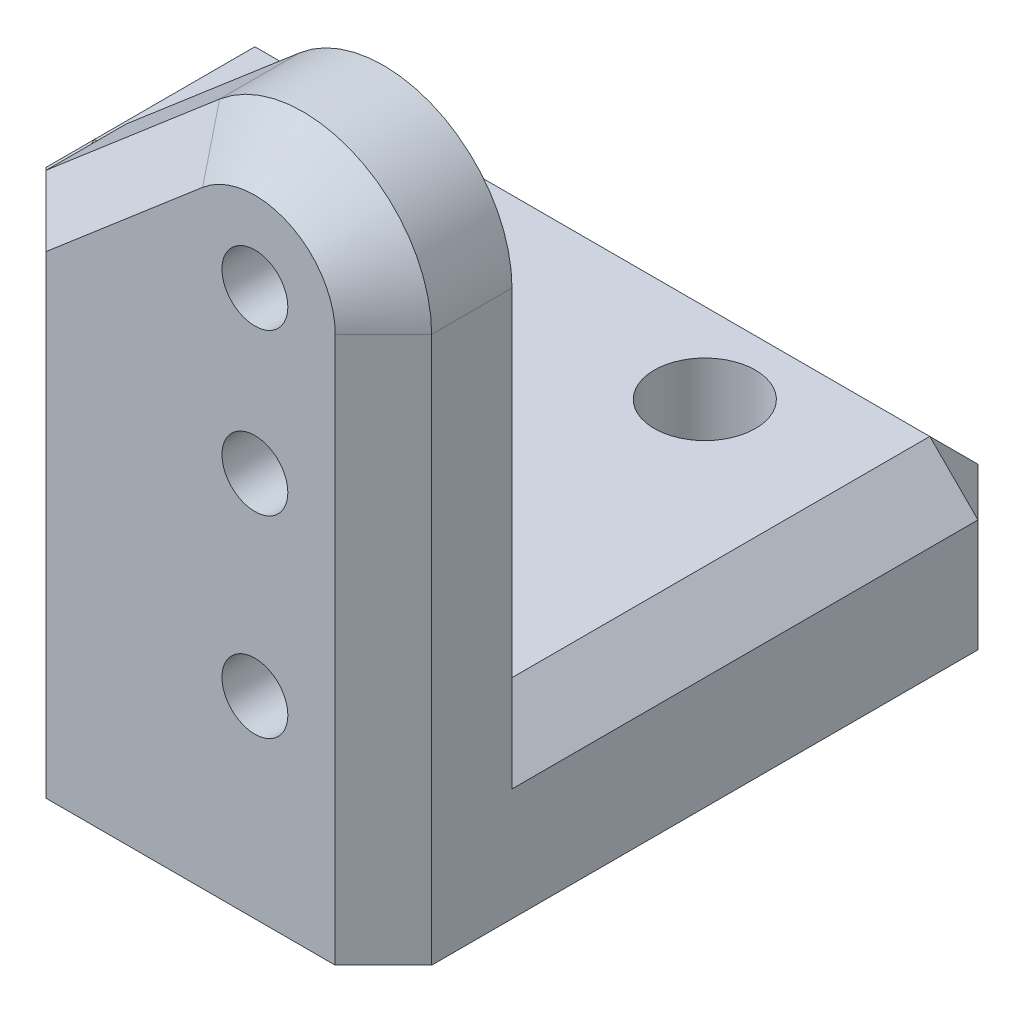
ISO-10303-21;
HEADER;
FILE_DESCRIPTION(('STEP AP214'),'2;1');
FILE_NAME('part.step','',(''),(''),'','','');
FILE_SCHEMA(('AUTOMOTIVE_DESIGN { 1 0 10303 214 1 1 1 1 }'));
ENDSEC;
DATA;
#1=APPLICATION_CONTEXT('core data for automotive mechanical design processes');
#2=APPLICATION_PROTOCOL_DEFINITION('international standard','automotive_design',2000,#1);
#3=PRODUCT_CONTEXT('',#1,'mechanical');
#4=PRODUCT('Part','Part','',(#3));
#5=PRODUCT_RELATED_PRODUCT_CATEGORY('part','',(#4));
#6=PRODUCT_DEFINITION_FORMATION('','',#4);
#7=PRODUCT_DEFINITION_CONTEXT('part definition',#1,'design');
#8=PRODUCT_DEFINITION('design','',#6,#7);
#9=PRODUCT_DEFINITION_SHAPE('','',#8);
#10=(LENGTH_UNIT() NAMED_UNIT(*) SI_UNIT(.MILLI.,.METRE.));
#11=(NAMED_UNIT(*) PLANE_ANGLE_UNIT() SI_UNIT($,.RADIAN.));
#12=(NAMED_UNIT(*) SI_UNIT($,.STERADIAN.) SOLID_ANGLE_UNIT());
#13=UNCERTAINTY_MEASURE_WITH_UNIT(LENGTH_MEASURE(1.E-05),#10,'distance_accuracy_value','');
#14=(GEOMETRIC_REPRESENTATION_CONTEXT(3) GLOBAL_UNCERTAINTY_ASSIGNED_CONTEXT((#13)) GLOBAL_UNIT_ASSIGNED_CONTEXT((#10,
#11,#12)) REPRESENTATION_CONTEXT('',''));
#15=CARTESIAN_POINT('',(0.,0.,0.));
#16=DIRECTION('',(0.,0.,1.));
#17=DIRECTION('',(1.,0.,0.));
#18=AXIS2_PLACEMENT_3D('',#15,#16,#17);
#19=CARTESIAN_POINT('',(12.,17.,20.));
#20=DIRECTION('',(0.,0.,-1.));
#21=DIRECTION('',(-1.,0.,0.));
#22=AXIS2_PLACEMENT_3D('',#19,#20,#21);
#23=PLANE('',#22);
#24=CARTESIAN_POINT('',(12.,6.,20.));
#25=DIRECTION('',(0.,0.,1.));
#26=DIRECTION('',(1.,0.,0.));
#27=AXIS2_PLACEMENT_3D('',#24,#25,#26);
#28=CIRCLE('',#27,1.025);
#29=CARTESIAN_POINT('',(13.025,6.,20.));
#30=VERTEX_POINT('',#29);
#31=EDGE_CURVE('E192',#30,#30,#28,.T.);
#32=ORIENTED_EDGE('',*,*,#31,.F.);
#33=EDGE_LOOP('',(#32));
#34=FACE_BOUND('',#33,.T.);
#35=CARTESIAN_POINT('',(12.,17.,20.));
#36=DIRECTION('',(0.,0.,1.));
#37=DIRECTION('',(1.,0.,0.));
#38=AXIS2_PLACEMENT_3D('',#35,#36,#37);
#39=CIRCLE('',#38,1.025);
#40=CARTESIAN_POINT('',(13.025,17.,20.));
#41=VERTEX_POINT('',#40);
#42=EDGE_CURVE('E357',#41,#41,#39,.T.);
#43=ORIENTED_EDGE('',*,*,#42,.F.);
#44=EDGE_LOOP('',(#43));
#45=FACE_BOUND('',#44,.T.);
#46=DIRECTION('',(1.,0.,0.));
#47=VECTOR('',#46,1.);
#48=CARTESIAN_POINT('',(16.,0.,20.));
#49=LINE('',#48,#47);
#50=CARTESIAN_POINT('',(5.50000000000001,0.,20.));
#51=VERTEX_POINT('',#50);
#52=CARTESIAN_POINT('',(14.5,0.,20.));
#53=VERTEX_POINT('',#52);
#54=EDGE_CURVE('E216',#51,#53,#49,.T.);
#55=ORIENTED_EDGE('',*,*,#54,.T.);
#56=DIRECTION('',(0.,1.,0.));
#57=VECTOR('',#56,1.);
#58=CARTESIAN_POINT('',(14.5,17.,20.));
#59=LINE('',#58,#57);
#60=CARTESIAN_POINT('',(14.5,17.,20.));
#61=VERTEX_POINT('',#60);
#62=EDGE_CURVE('E234',#53,#61,#59,.T.);
#63=ORIENTED_EDGE('',*,*,#62,.T.);
#64=CARTESIAN_POINT('',(12.,17.,20.));
#65=DIRECTION('',(0.,0.,-1.));
#66=DIRECTION('',(-1.,0.,0.));
#67=AXIS2_PLACEMENT_3D('',#64,#65,#66);
#68=CIRCLE('',#67,2.49999999999999);
#69=CARTESIAN_POINT('',(10.37505052686,18.899878735536,20.));
#70=VERTEX_POINT('',#69);
#71=EDGE_CURVE('E232',#61,#70,#68,.F.);
#72=ORIENTED_EDGE('',*,*,#71,.T.);
#73=DIRECTION('',(-0.759951494214413,-0.649979789256005,0.));
#74=VECTOR('',#73,1.);
#75=CARTESIAN_POINT('',(10.37505052686,18.899878735536,20.));
#76=LINE('',#75,#74);
#77=CARTESIAN_POINT('',(5.50000000000001,14.7302911524017,20.));
#78=VERTEX_POINT('',#77);
#79=EDGE_CURVE('E230',#70,#78,#76,.T.);
#80=ORIENTED_EDGE('',*,*,#79,.T.);
#81=DIRECTION('',(0.,-1.,0.));
#82=VECTOR('',#81,1.);
#83=CARTESIAN_POINT('',(5.50000000000001,17.,20.));
#84=LINE('',#83,#82);
#85=EDGE_CURVE('E228',#78,#51,#84,.T.);
#86=ORIENTED_EDGE('',*,*,#85,.T.);
#87=EDGE_LOOP('',(#55,#63,#72,#80,#86));
#88=FACE_BOUND('',#87,.T.);
#89=CARTESIAN_POINT('',(12.,12.,20.));
#90=DIRECTION('',(0.,0.,1.));
#91=DIRECTION('',(1.,0.,0.));
#92=AXIS2_PLACEMENT_3D('',#89,#90,#91);
#93=CIRCLE('',#92,1.025);
#94=CARTESIAN_POINT('',(13.025,12.,20.));
#95=VERTEX_POINT('',#94);
#96=EDGE_CURVE('E191',#95,#95,#93,.T.);
#97=ORIENTED_EDGE('',*,*,#96,.F.);
#98=EDGE_LOOP('',(#97));
#99=FACE_BOUND('',#98,.T.);
#100=ADVANCED_FACE('F43',(#34,#45,#88,#99),#23,.F.);
#101=CARTESIAN_POINT('',(-4.,5.,0.));
#102=DIRECTION('',(0.,-1.,0.));
#103=DIRECTION('',(0.,0.,-1.));
#104=AXIS2_PLACEMENT_3D('',#101,#102,#103);
#105=PLANE('',#104);
#106=CARTESIAN_POINT('',(-2.,5.,4.00000000000001));
#107=DIRECTION('',(0.,-1.,0.));
#108=DIRECTION('',(0.,0.,-1.));
#109=AXIS2_PLACEMENT_3D('',#106,#107,#108);
#110=CIRCLE('',#109,1.575);
#111=CARTESIAN_POINT('',(-2.,5.,2.42500000000001));
#112=VERTEX_POINT('',#111);
#113=EDGE_CURVE('E894',#112,#112,#110,.T.);
#114=ORIENTED_EDGE('',*,*,#113,.T.);
#115=EDGE_LOOP('',(#114));
#116=FACE_BOUND('',#115,.T.);
#117=CARTESIAN_POINT('',(10.,5.,4.00000000000001));
#118=DIRECTION('',(0.,-1.,0.));
#119=DIRECTION('',(0.,0.,-1.));
#120=AXIS2_PLACEMENT_3D('',#117,#118,#119);
#121=CIRCLE('',#120,1.575);
#122=CARTESIAN_POINT('',(10.,5.,2.42500000000001));
#123=VERTEX_POINT('',#122);
#124=EDGE_CURVE('E900',#123,#123,#121,.T.);
#125=ORIENTED_EDGE('',*,*,#124,.T.);
#126=EDGE_LOOP('',(#125));
#127=FACE_BOUND('',#126,.T.);
#128=CARTESIAN_POINT('',(10.,5.,14.));
#129=DIRECTION('',(0.,-1.,0.));
#130=DIRECTION('',(0.,0.,-1.));
#131=AXIS2_PLACEMENT_3D('',#128,#129,#130);
#132=CIRCLE('',#131,1.575);
#133=CARTESIAN_POINT('',(10.,5.,12.425));
#134=VERTEX_POINT('',#133);
#135=EDGE_CURVE('E316',#134,#134,#132,.T.);
#136=ORIENTED_EDGE('',*,*,#135,.T.);
#137=EDGE_LOOP('',(#136));
#138=FACE_BOUND('',#137,.T.);
#139=DIRECTION('',(1.,0.,0.));
#140=VECTOR('',#139,1.);
#141=CARTESIAN_POINT('',(-4.,5.,16.));
#142=LINE('',#141,#140);
#143=CARTESIAN_POINT('',(5.50000000000001,5.,16.));
#144=VERTEX_POINT('',#143);
#145=CARTESIAN_POINT('',(11.775,5.,16.));
#146=VERTEX_POINT('',#145);
#147=EDGE_CURVE('E204',#144,#146,#142,.T.);
#148=ORIENTED_EDGE('',*,*,#147,.T.);
#149=CARTESIAN_POINT('',(12.225,5.,16.));
#150=VERTEX_POINT('',#149);
#151=EDGE_CURVE('E190',#146,#150,#142,.T.);
#152=ORIENTED_EDGE('',*,*,#151,.T.);
#153=CARTESIAN_POINT('',(14.5,5.,16.));
#154=VERTEX_POINT('',#153);
#155=EDGE_CURVE('E195',#150,#154,#142,.T.);
#156=ORIENTED_EDGE('',*,*,#155,.T.);
#157=DIRECTION('',(0.,0.,-1.));
#158=VECTOR('',#157,1.);
#159=CARTESIAN_POINT('',(14.5,5.,0.));
#160=LINE('',#159,#158);
#161=CARTESIAN_POINT('',(14.5,5.,1.5));
#162=VERTEX_POINT('',#161);
#163=EDGE_CURVE('E274',#154,#162,#160,.T.);
#164=ORIENTED_EDGE('',*,*,#163,.T.);
#165=DIRECTION('',(-1.,0.,0.));
#166=VECTOR('',#165,1.);
#167=CARTESIAN_POINT('',(-8.,5.,1.5));
#168=LINE('',#167,#166);
#169=CARTESIAN_POINT('',(-6.50000000000001,5.,1.5));
#170=VERTEX_POINT('',#169);
#171=EDGE_CURVE('E272',#162,#170,#168,.T.);
#172=ORIENTED_EDGE('',*,*,#171,.T.);
#173=DIRECTION('',(0.,0.,1.));
#174=VECTOR('',#173,1.);
#175=CARTESIAN_POINT('',(-6.50000000000001,5.,0.));
#176=LINE('',#175,#174);
#177=CARTESIAN_POINT('',(-6.50000000000001,5.,6.50000000000001));
#178=VERTEX_POINT('',#177);
#179=EDGE_CURVE('E270',#170,#178,#176,.T.);
#180=ORIENTED_EDGE('',*,*,#179,.T.);
#181=DIRECTION('',(1.,0.,0.));
#182=VECTOR('',#181,1.);
#183=CARTESIAN_POINT('',(-4.,5.,6.50000000000001));
#184=LINE('',#183,#182);
#185=CARTESIAN_POINT('',(2.5,5.,6.50000000000001));
#186=VERTEX_POINT('',#185);
#187=EDGE_CURVE('E268',#178,#186,#184,.T.);
#188=ORIENTED_EDGE('',*,*,#187,.T.);
#189=DIRECTION('',(-0.707106781186551,0.,-0.707106781186544));
#190=VECTOR('',#189,1.);
#191=CARTESIAN_POINT('',(2.5,5.,6.50000000000001));
#192=LINE('',#191,#190);
#193=CARTESIAN_POINT('',(4.,5.,8.));
#194=VERTEX_POINT('',#193);
#195=EDGE_CURVE('E265',#194,#186,#192,.T.);
#196=ORIENTED_EDGE('',*,*,#195,.F.);
#197=DIRECTION('',(-0.707106781186551,0.,-0.707106781186544));
#198=VECTOR('',#197,1.);
#199=CARTESIAN_POINT('',(2.5,5.,6.50000000000001));
#200=LINE('',#199,#198);
#201=CARTESIAN_POINT('',(5.50000000000001,5.,9.49999999999999));
#202=VERTEX_POINT('',#201);
#203=EDGE_CURVE('E262',#202,#194,#200,.T.);
#204=ORIENTED_EDGE('',*,*,#203,.F.);
#205=DIRECTION('',(0.,0.,1.));
#206=VECTOR('',#205,1.);
#207=CARTESIAN_POINT('',(5.50000000000001,5.,0.));
#208=LINE('',#207,#206);
#209=EDGE_CURVE('E250',#202,#144,#208,.T.);
#210=ORIENTED_EDGE('',*,*,#209,.T.);
#211=EDGE_LOOP('',(#148,#152,#156,#164,#172,#180,#188,#196,#204,#210));
#212=FACE_BOUND('',#211,.T.);
#213=ADVANCED_FACE('F205',(#116,#127,#138,#212),#105,.F.);
#214=CARTESIAN_POINT('',(4.,0.,0.));
#215=DIRECTION('',(1.,0.,0.));
#216=DIRECTION('',(0.,0.,-1.));
#217=AXIS2_PLACEMENT_3D('',#214,#215,#216);
#218=PLANE('',#217);
#219=DIRECTION('',(0.,1.,0.));
#220=VECTOR('',#219,1.);
#221=CARTESIAN_POINT('',(4.,5.,16.));
#222=LINE('',#221,#220);
#223=CARTESIAN_POINT('',(4.,3.50000000000001,16.));
#224=VERTEX_POINT('',#223);
#225=CARTESIAN_POINT('',(4.,15.4211646096066,16.));
#226=VERTEX_POINT('',#225);
#227=EDGE_CURVE('E66',#224,#226,#222,.T.);
#228=ORIENTED_EDGE('',*,*,#227,.F.);
#229=DIRECTION('',(0.,0.,-1.));
#230=VECTOR('',#229,1.);
#231=CARTESIAN_POINT('',(4.,3.50000000000001,0.));
#232=LINE('',#231,#230);
#233=CARTESIAN_POINT('',(4.,3.50000000000001,9.49999999999999));
#234=VERTEX_POINT('',#233);
#235=EDGE_CURVE('E307',#224,#234,#232,.T.);
#236=ORIENTED_EDGE('',*,*,#235,.T.);
#237=DIRECTION('',(0.,-1.,0.));
#238=VECTOR('',#237,1.);
#239=CARTESIAN_POINT('',(4.,0.,9.49999999999999));
#240=LINE('',#239,#238);
#241=CARTESIAN_POINT('',(4.,0.,9.49999999999999));
#242=VERTEX_POINT('',#241);
#243=EDGE_CURVE('E305',#234,#242,#240,.T.);
#244=ORIENTED_EDGE('',*,*,#243,.T.);
#245=DIRECTION('',(0.,0.,1.));
#246=VECTOR('',#245,1.);
#247=CARTESIAN_POINT('',(4.,0.,0.));
#248=LINE('',#247,#246);
#249=CARTESIAN_POINT('',(4.,0.,18.5));
#250=VERTEX_POINT('',#249);
#251=EDGE_CURVE('E260',#242,#250,#248,.T.);
#252=ORIENTED_EDGE('',*,*,#251,.T.);
#253=DIRECTION('',(0.,1.,0.));
#254=VECTOR('',#253,1.);
#255=CARTESIAN_POINT('',(4.,0.,18.5));
#256=LINE('',#255,#254);
#257=CARTESIAN_POINT('',(4.,15.4211646096066,18.5));
#258=VERTEX_POINT('',#257);
#259=EDGE_CURVE('E248',#250,#258,#256,.T.);
#260=ORIENTED_EDGE('',*,*,#259,.T.);
#261=DIRECTION('',(0.,0.,1.));
#262=VECTOR('',#261,1.);
#263=CARTESIAN_POINT('',(4.,15.4211646096066,0.));
#264=LINE('',#263,#262);
#265=EDGE_CURVE('E366',#226,#258,#264,.T.);
#266=ORIENTED_EDGE('',*,*,#265,.F.);
#267=EDGE_LOOP('',(#228,#236,#244,#252,#260,#266));
#268=FACE_BOUND('',#267,.T.);
#269=ADVANCED_FACE('F431',(#268),#218,.F.);
#270=CARTESIAN_POINT('',(16.,0.,20.));
#271=DIRECTION('',(0.,1.,0.));
#272=DIRECTION('',(0.,0.,1.));
#273=AXIS2_PLACEMENT_3D('',#270,#271,#272);
#274=PLANE('',#273);
#275=CARTESIAN_POINT('',(-2.,0.,4.00000000000001));
#276=DIRECTION('',(0.,-1.,0.));
#277=DIRECTION('',(0.,0.,-1.));
#278=AXIS2_PLACEMENT_3D('',#275,#276,#277);
#279=CIRCLE('',#278,1.575);
#280=CARTESIAN_POINT('',(-2.,0.,2.42500000000001));
#281=VERTEX_POINT('',#280);
#282=EDGE_CURVE('E888',#281,#281,#279,.T.);
#283=ORIENTED_EDGE('',*,*,#282,.F.);
#284=EDGE_LOOP('',(#283));
#285=FACE_BOUND('',#284,.T.);
#286=CARTESIAN_POINT('',(10.,0.,4.00000000000001));
#287=DIRECTION('',(0.,-1.,0.));
#288=DIRECTION('',(0.,0.,-1.));
#289=AXIS2_PLACEMENT_3D('',#286,#287,#288);
#290=CIRCLE('',#289,1.575);
#291=CARTESIAN_POINT('',(10.,0.,2.42500000000001));
#292=VERTEX_POINT('',#291);
#293=EDGE_CURVE('E897',#292,#292,#290,.T.);
#294=ORIENTED_EDGE('',*,*,#293,.F.);
#295=EDGE_LOOP('',(#294));
#296=FACE_BOUND('',#295,.T.);
#297=CARTESIAN_POINT('',(10.,0.,14.));
#298=DIRECTION('',(0.,-1.,0.));
#299=DIRECTION('',(0.,0.,-1.));
#300=AXIS2_PLACEMENT_3D('',#297,#298,#299);
#301=CIRCLE('',#300,1.575);
#302=CARTESIAN_POINT('',(10.,0.,12.425));
#303=VERTEX_POINT('',#302);
#304=EDGE_CURVE('E902',#303,#303,#301,.T.);
#305=ORIENTED_EDGE('',*,*,#304,.F.);
#306=EDGE_LOOP('',(#305));
#307=FACE_BOUND('',#306,.T.);
#308=DIRECTION('',(1.,0.,0.));
#309=VECTOR('',#308,1.);
#310=CARTESIAN_POINT('',(16.,0.,0.));
#311=LINE('',#310,#309);
#312=CARTESIAN_POINT('',(-6.50000000000001,0.,0.));
#313=VERTEX_POINT('',#312);
#314=CARTESIAN_POINT('',(14.5,0.,0.));
#315=VERTEX_POINT('',#314);
#316=EDGE_CURVE('E215',#313,#315,#311,.T.);
#317=ORIENTED_EDGE('',*,*,#316,.T.);
#318=DIRECTION('',(0.707106781186544,0.,0.707106781186551));
#319=VECTOR('',#318,1.);
#320=CARTESIAN_POINT('',(16.,0.,1.5));
#321=LINE('',#320,#319);
#322=CARTESIAN_POINT('',(16.,0.,1.5));
#323=VERTEX_POINT('',#322);
#324=EDGE_CURVE('E291',#315,#323,#321,.T.);
#325=ORIENTED_EDGE('',*,*,#324,.T.);
#326=DIRECTION('',(0.,0.,-1.));
#327=VECTOR('',#326,1.);
#328=CARTESIAN_POINT('',(16.,0.,20.));
#329=LINE('',#328,#327);
#330=CARTESIAN_POINT('',(16.,0.,18.5));
#331=VERTEX_POINT('',#330);
#332=EDGE_CURVE('E225',#331,#323,#329,.T.);
#333=ORIENTED_EDGE('',*,*,#332,.F.);
#334=DIRECTION('',(0.707106781186549,0.,-0.707106781186546));
#335=VECTOR('',#334,1.);
#336=CARTESIAN_POINT('',(14.5,0.,20.));
#337=LINE('',#336,#335);
#338=EDGE_CURVE('E242',#331,#53,#337,.F.);
#339=ORIENTED_EDGE('',*,*,#338,.T.);
#340=ORIENTED_EDGE('',*,*,#54,.F.);
#341=DIRECTION('',(0.707106781186549,0.,0.707106781186546));
#342=VECTOR('',#341,1.);
#343=CARTESIAN_POINT('',(4.,0.,18.5));
#344=LINE('',#343,#342);
#345=EDGE_CURVE('E239',#51,#250,#344,.F.);
#346=ORIENTED_EDGE('',*,*,#345,.T.);
#347=ORIENTED_EDGE('',*,*,#251,.F.);
#348=DIRECTION('',(0.707106781186551,0.,0.707106781186544));
#349=VECTOR('',#348,1.);
#350=CARTESIAN_POINT('',(15.2500000000001,0.,20.75));
#351=LINE('',#350,#349);
#352=CARTESIAN_POINT('',(2.5,0.,8.));
#353=VERTEX_POINT('',#352);
#354=EDGE_CURVE('E52',#242,#353,#351,.F.);
#355=ORIENTED_EDGE('',*,*,#354,.T.);
#356=DIRECTION('',(1.,0.,0.));
#357=VECTOR('',#356,1.);
#358=CARTESIAN_POINT('',(-8.,0.,8.));
#359=LINE('',#358,#357);
#360=CARTESIAN_POINT('',(-6.5,0.,8.));
#361=VERTEX_POINT('',#360);
#362=EDGE_CURVE('E351',#361,#353,#359,.T.);
#363=ORIENTED_EDGE('',*,*,#362,.F.);
#364=DIRECTION('',(0.707106781186551,0.,0.707106781186544));
#365=VECTOR('',#364,1.);
#366=CARTESIAN_POINT('',(-8.,0.,6.50000000000001));
#367=LINE('',#366,#365);
#368=CARTESIAN_POINT('',(-8.,0.,6.50000000000001));
#369=VERTEX_POINT('',#368);
#370=EDGE_CURVE('E287',#361,#369,#367,.F.);
#371=ORIENTED_EDGE('',*,*,#370,.T.);
#372=DIRECTION('',(0.,0.,1.));
#373=VECTOR('',#372,1.);
#374=CARTESIAN_POINT('',(-8.,0.,8.));
#375=LINE('',#374,#373);
#376=CARTESIAN_POINT('',(-8.,0.,1.5));
#377=VERTEX_POINT('',#376);
#378=EDGE_CURVE('E347',#377,#369,#375,.T.);
#379=ORIENTED_EDGE('',*,*,#378,.F.);
#380=DIRECTION('',(0.707106781186544,0.,-0.707106781186551));
#381=VECTOR('',#380,1.);
#382=CARTESIAN_POINT('',(-8.,0.,1.5));
#383=LINE('',#382,#381);
#384=EDGE_CURVE('E289',#377,#313,#383,.T.);
#385=ORIENTED_EDGE('',*,*,#384,.T.);
#386=EDGE_LOOP('',(#317,#325,#333,#339,#340,#346,#347,#355,#363,#371,#379,#385));
#387=FACE_BOUND('',#386,.T.);
#388=ADVANCED_FACE('F407',(#285,#296,#307,#387),#274,.F.);
#389=CARTESIAN_POINT('',(16.,17.,20.));
#390=DIRECTION('',(-1.,0.,0.));
#391=DIRECTION('',(0.,0.,1.));
#392=AXIS2_PLACEMENT_3D('',#389,#390,#391);
#393=PLANE('',#392);
#394=DIRECTION('',(0.,0.,1.));
#395=VECTOR('',#394,1.);
#396=CARTESIAN_POINT('',(16.,3.50000000000001,20.));
#397=LINE('',#396,#395);
#398=CARTESIAN_POINT('',(16.,3.50000000000001,1.5));
#399=VERTEX_POINT('',#398);
#400=CARTESIAN_POINT('',(16.,3.50000000000001,16.));
#401=VERTEX_POINT('',#400);
#402=EDGE_CURVE('E278',#399,#401,#397,.T.);
#403=ORIENTED_EDGE('',*,*,#402,.T.);
#404=DIRECTION('',(0.,-1.,0.));
#405=VECTOR('',#404,1.);
#406=CARTESIAN_POINT('',(16.,5.,16.));
#407=LINE('',#406,#405);
#408=CARTESIAN_POINT('',(16.,17.,16.));
#409=VERTEX_POINT('',#408);
#410=EDGE_CURVE('E202',#409,#401,#407,.T.);
#411=ORIENTED_EDGE('',*,*,#410,.F.);
#412=DIRECTION('',(0.,0.,-1.));
#413=VECTOR('',#412,1.);
#414=CARTESIAN_POINT('',(16.,17.,20.));
#415=LINE('',#414,#413);
#416=CARTESIAN_POINT('',(16.,17.,18.5));
#417=VERTEX_POINT('',#416);
#418=EDGE_CURVE('E223',#417,#409,#415,.T.);
#419=ORIENTED_EDGE('',*,*,#418,.F.);
#420=DIRECTION('',(0.,-1.,0.));
#421=VECTOR('',#420,1.);
#422=CARTESIAN_POINT('',(16.,17.,18.5));
#423=LINE('',#422,#421);
#424=EDGE_CURVE('E237',#417,#331,#423,.T.);
#425=ORIENTED_EDGE('',*,*,#424,.T.);
#426=ORIENTED_EDGE('',*,*,#332,.T.);
#427=DIRECTION('',(0.,1.,0.));
#428=VECTOR('',#427,1.);
#429=CARTESIAN_POINT('',(16.,5.,1.5));
#430=LINE('',#429,#428);
#431=EDGE_CURVE('E276',#323,#399,#430,.T.);
#432=ORIENTED_EDGE('',*,*,#431,.T.);
#433=EDGE_LOOP('',(#403,#411,#419,#425,#426,#432));
#434=FACE_BOUND('',#433,.T.);
#435=ADVANCED_FACE('F375',(#434),#393,.F.);
#436=CARTESIAN_POINT('',(12.,17.,20.));
#437=DIRECTION('',(0.,0.,-1.));
#438=DIRECTION('',(-1.,0.,0.));
#439=AXIS2_PLACEMENT_3D('',#436,#437,#438);
#440=CYLINDRICAL_SURFACE('',#439,4.);
#441=DIRECTION('',(0.,0.,-1.));
#442=VECTOR('',#441,1.);
#443=CARTESIAN_POINT('',(9.40008084297598,20.0398059768577,20.));
#444=LINE('',#443,#442);
#445=CARTESIAN_POINT('',(9.40008084297598,20.0398059768577,18.5));
#446=VERTEX_POINT('',#445);
#447=CARTESIAN_POINT('',(9.40008084297598,20.0398059768577,16.));
#448=VERTEX_POINT('',#447);
#449=EDGE_CURVE('E219',#446,#448,#444,.T.);
#450=ORIENTED_EDGE('',*,*,#449,.F.);
#451=CARTESIAN_POINT('',(12.,17.,18.5));
#452=DIRECTION('',(0.,0.,-1.));
#453=DIRECTION('',(-1.,0.,0.));
#454=AXIS2_PLACEMENT_3D('',#451,#452,#453);
#455=CIRCLE('',#454,4.);
#456=EDGE_CURVE('E244',#446,#417,#455,.T.);
#457=ORIENTED_EDGE('',*,*,#456,.T.);
#458=ORIENTED_EDGE('',*,*,#418,.T.);
#459=CARTESIAN_POINT('',(12.,17.,16.));
#460=DIRECTION('',(0.,0.,1.));
#461=DIRECTION('',(1.,0.,0.));
#462=AXIS2_PLACEMENT_3D('',#459,#460,#461);
#463=CIRCLE('',#462,4.);
#464=EDGE_CURVE('E212',#409,#448,#463,.T.);
#465=ORIENTED_EDGE('',*,*,#464,.T.);
#466=EDGE_LOOP('',(#450,#457,#458,#465));
#467=FACE_BOUND('',#466,.T.);
#468=ADVANCED_FACE('F436',(#467),#440,.T.);
#469=CARTESIAN_POINT('',(0.,12.,20.));
#470=DIRECTION('',(0.649979789256005,-0.759951494214413,0.));
#471=DIRECTION('',(0.759951494214413,0.649979789256005,0.));
#472=AXIS2_PLACEMENT_3D('',#469,#470,#471);
#473=PLANE('',#472);
#474=ORIENTED_EDGE('',*,*,#265,.T.);
#475=DIRECTION('',(0.759951494214413,0.649979789256005,0.));
#476=VECTOR('',#475,1.);
#477=CARTESIAN_POINT('',(0.,12.,18.5));
#478=LINE('',#477,#476);
#479=EDGE_CURVE('E246',#258,#446,#478,.T.);
#480=ORIENTED_EDGE('',*,*,#479,.T.);
#481=ORIENTED_EDGE('',*,*,#449,.T.);
#482=DIRECTION('',(-0.759951494214413,-0.649979789256005,0.));
#483=VECTOR('',#482,1.);
#484=CARTESIAN_POINT('',(0.,12.,16.));
#485=LINE('',#484,#483);
#486=EDGE_CURVE('E206',#448,#226,#485,.T.);
#487=ORIENTED_EDGE('',*,*,#486,.T.);
#488=EDGE_LOOP('',(#474,#480,#481,#487));
#489=FACE_BOUND('',#488,.T.);
#490=ADVANCED_FACE('F433',(#489),#473,.F.);
#491=CARTESIAN_POINT('',(12.,17.,0.));
#492=DIRECTION('',(0.,0.,-1.));
#493=DIRECTION('',(-1.,0.,0.));
#494=AXIS2_PLACEMENT_3D('',#491,#492,#493);
#495=PLANE('',#494);
#496=DIRECTION('',(1.,0.,0.));
#497=VECTOR('',#496,1.);
#498=CARTESIAN_POINT('',(16.,3.50000000000001,0.));
#499=LINE('',#498,#497);
#500=CARTESIAN_POINT('',(-6.50000000000001,3.50000000000001,0.));
#501=VERTEX_POINT('',#500);
#502=CARTESIAN_POINT('',(14.5,3.50000000000001,0.));
#503=VERTEX_POINT('',#502);
#504=EDGE_CURVE('E283',#501,#503,#499,.T.);
#505=ORIENTED_EDGE('',*,*,#504,.T.);
#506=DIRECTION('',(0.,-1.,0.));
#507=VECTOR('',#506,1.);
#508=CARTESIAN_POINT('',(14.5,0.,0.));
#509=LINE('',#508,#507);
#510=EDGE_CURVE('E285',#503,#315,#509,.T.);
#511=ORIENTED_EDGE('',*,*,#510,.T.);
#512=ORIENTED_EDGE('',*,*,#316,.F.);
#513=DIRECTION('',(0.,1.,0.));
#514=VECTOR('',#513,1.);
#515=CARTESIAN_POINT('',(-6.50000000000001,5.,0.));
#516=LINE('',#515,#514);
#517=EDGE_CURVE('E281',#313,#501,#516,.T.);
#518=ORIENTED_EDGE('',*,*,#517,.T.);
#519=EDGE_LOOP('',(#505,#511,#512,#518));
#520=FACE_BOUND('',#519,.T.);
#521=ADVANCED_FACE('F399',(#520),#495,.T.);
#522=CARTESIAN_POINT('',(-4.,5.,16.));
#523=DIRECTION('',(0.,0.,1.));
#524=DIRECTION('',(1.,0.,0.));
#525=AXIS2_PLACEMENT_3D('',#522,#523,#524);
#526=PLANE('',#525);
#527=CARTESIAN_POINT('',(12.,12.,16.));
#528=DIRECTION('',(0.,0.,1.));
#529=DIRECTION('',(1.,0.,0.));
#530=AXIS2_PLACEMENT_3D('',#527,#528,#529);
#531=CIRCLE('',#530,1.025);
#532=CARTESIAN_POINT('',(13.025,12.,16.));
#533=VERTEX_POINT('',#532);
#534=EDGE_CURVE('E470',#533,#533,#531,.T.);
#535=ORIENTED_EDGE('',*,*,#534,.T.);
#536=EDGE_LOOP('',(#535));
#537=FACE_BOUND('',#536,.T.);
#538=CARTESIAN_POINT('',(12.,17.,16.));
#539=DIRECTION('',(0.,0.,1.));
#540=DIRECTION('',(1.,0.,0.));
#541=AXIS2_PLACEMENT_3D('',#538,#539,#540);
#542=CIRCLE('',#541,1.025);
#543=CARTESIAN_POINT('',(13.025,17.,16.));
#544=VERTEX_POINT('',#543);
#545=EDGE_CURVE('E254',#544,#544,#542,.T.);
#546=ORIENTED_EDGE('',*,*,#545,.T.);
#547=EDGE_LOOP('',(#546));
#548=FACE_BOUND('',#547,.T.);
#549=ORIENTED_EDGE('',*,*,#155,.F.);
#550=CARTESIAN_POINT('',(12.,6.,16.));
#551=DIRECTION('',(0.,0.,1.));
#552=DIRECTION('',(1.,0.,0.));
#553=AXIS2_PLACEMENT_3D('',#550,#551,#552);
#554=CIRCLE('',#553,1.025);
#555=EDGE_CURVE('E11',#150,#146,#554,.T.);
#556=ORIENTED_EDGE('',*,*,#555,.T.);
#557=ORIENTED_EDGE('',*,*,#147,.F.);
#558=DIRECTION('',(0.707106781186551,0.707106781186544,0.));
#559=VECTOR('',#558,1.);
#560=CARTESIAN_POINT('',(0.749999999999958,0.249999999999995,16.));
#561=LINE('',#560,#559);
#562=EDGE_CURVE('E310',#144,#224,#561,.F.);
#563=ORIENTED_EDGE('',*,*,#562,.T.);
#564=ORIENTED_EDGE('',*,*,#227,.T.);
#565=ORIENTED_EDGE('',*,*,#486,.F.);
#566=ORIENTED_EDGE('',*,*,#464,.F.);
#567=ORIENTED_EDGE('',*,*,#410,.T.);
#568=DIRECTION('',(0.707106781186551,-0.707106781186544,0.));
#569=VECTOR('',#568,1.);
#570=CARTESIAN_POINT('',(5.24999999999991,14.25,16.));
#571=LINE('',#570,#569);
#572=EDGE_CURVE('E198',#401,#154,#571,.F.);
#573=ORIENTED_EDGE('',*,*,#572,.T.);
#574=EDGE_LOOP('',(#549,#556,#557,#563,#564,#565,#566,#567,#573));
#575=FACE_BOUND('',#574,.T.);
#576=ADVANCED_FACE('F196',(#537,#548,#575),#526,.F.);
#577=CARTESIAN_POINT('',(4.,0.,18.5));
#578=DIRECTION('',(0.707106781186546,0.,-0.707106781186549));
#579=DIRECTION('',(0.,1.,0.));
#580=AXIS2_PLACEMENT_3D('',#577,#578,#579);
#581=PLANE('',#580);
#582=ORIENTED_EDGE('',*,*,#345,.F.);
#583=ORIENTED_EDGE('',*,*,#85,.F.);
#584=DIRECTION('',(-0.67234794595281,0.309671566576716,-0.672347945952807));
#585=VECTOR('',#584,1.);
#586=CARTESIAN_POINT('',(7.2107950630559,13.9423292192132,21.7107950630559));
#587=LINE('',#586,#585);
#588=EDGE_CURVE('E257',#258,#78,#587,.F.);
#589=ORIENTED_EDGE('',*,*,#588,.F.);
#590=ORIENTED_EDGE('',*,*,#259,.F.);
#591=EDGE_LOOP('',(#582,#583,#589,#590));
#592=FACE_BOUND('',#591,.T.);
#593=ADVANCED_FACE('F428',(#592),#581,.F.);
#594=CARTESIAN_POINT('',(10.37505052686,18.899878735536,20.));
#595=DIRECTION('',(0.459605116617124,-0.53736685493186,-0.707106781186549));
#596=DIRECTION('',(-0.759951494214413,-0.649979789256005,0.));
#597=AXIS2_PLACEMENT_3D('',#594,#595,#596);
#598=PLANE('',#597);
#599=ORIENTED_EDGE('',*,*,#588,.T.);
#600=ORIENTED_EDGE('',*,*,#79,.F.);
#601=DIRECTION('',(0.459605116617125,-0.537366854931862,0.707106781186546));
#602=VECTOR('',#601,1.);
#603=CARTESIAN_POINT('',(9.40008084297598,20.0398059768577,18.5));
#604=LINE('',#603,#602);
#605=EDGE_CURVE('E253',#446,#70,#604,.T.);
#606=ORIENTED_EDGE('',*,*,#605,.F.);
#607=ORIENTED_EDGE('',*,*,#479,.F.);
#608=EDGE_LOOP('',(#599,#600,#606,#607));
#609=FACE_BOUND('',#608,.T.);
#610=ADVANCED_FACE('F465',(#609),#598,.F.);
#611=CARTESIAN_POINT('',(12.,17.,20.));
#612=DIRECTION('',(0.,0.,-1.));
#613=DIRECTION('',(-1.,0.,0.));
#614=AXIS2_PLACEMENT_3D('',#611,#612,#613);
#615=CONICAL_SURFACE('',#614,2.49999999999999,0.78539816339745);
#616=ORIENTED_EDGE('',*,*,#605,.T.);
#617=ORIENTED_EDGE('',*,*,#71,.F.);
#618=DIRECTION('',(-0.707106781186549,0.,0.707106781186546));
#619=VECTOR('',#618,1.);
#620=CARTESIAN_POINT('',(16.,17.,18.5));
#621=LINE('',#620,#619);
#622=EDGE_CURVE('E251',#417,#61,#621,.T.);
#623=ORIENTED_EDGE('',*,*,#622,.F.);
#624=ORIENTED_EDGE('',*,*,#456,.F.);
#625=EDGE_LOOP('',(#616,#617,#623,#624));
#626=FACE_BOUND('',#625,.T.);
#627=ADVANCED_FACE('F417',(#626),#615,.T.);
#628=CARTESIAN_POINT('',(14.5,17.,20.));
#629=DIRECTION('',(-0.707106781186546,0.,-0.707106781186549));
#630=DIRECTION('',(0.,1.,0.));
#631=AXIS2_PLACEMENT_3D('',#628,#629,#630);
#632=PLANE('',#631);
#633=ORIENTED_EDGE('',*,*,#338,.F.);
#634=ORIENTED_EDGE('',*,*,#424,.F.);
#635=ORIENTED_EDGE('',*,*,#622,.T.);
#636=ORIENTED_EDGE('',*,*,#62,.F.);
#637=EDGE_LOOP('',(#633,#634,#635,#636));
#638=FACE_BOUND('',#637,.T.);
#639=ADVANCED_FACE('F412',(#638),#632,.F.);
#640=CARTESIAN_POINT('',(12.,17.,20.));
#641=DIRECTION('',(0.,0.,1.));
#642=DIRECTION('',(1.,0.,0.));
#643=AXIS2_PLACEMENT_3D('',#640,#641,#642);
#644=CYLINDRICAL_SURFACE('',#643,1.025);
#645=ORIENTED_EDGE('',*,*,#42,.T.);
#646=EDGE_LOOP('',(#645));
#647=FACE_BOUND('',#646,.T.);
#648=ORIENTED_EDGE('',*,*,#545,.F.);
#649=EDGE_LOOP('',(#648));
#650=FACE_BOUND('',#649,.T.);
#651=ADVANCED_FACE('F473',(#647,#650),#644,.F.);
#652=CARTESIAN_POINT('',(-8.,5.,8.));
#653=DIRECTION('',(0.,0.,-1.));
#654=DIRECTION('',(-1.,0.,0.));
#655=AXIS2_PLACEMENT_3D('',#652,#653,#654);
#656=PLANE('',#655);
#657=DIRECTION('',(-1.,0.,0.));
#658=VECTOR('',#657,1.);
#659=CARTESIAN_POINT('',(-8.,3.49999999999999,8.));
#660=LINE('',#659,#658);
#661=CARTESIAN_POINT('',(2.5,3.49999999999999,8.));
#662=VERTEX_POINT('',#661);
#663=CARTESIAN_POINT('',(-6.5,3.49999999999999,8.));
#664=VERTEX_POINT('',#663);
#665=EDGE_CURVE('E301',#662,#664,#660,.T.);
#666=ORIENTED_EDGE('',*,*,#665,.T.);
#667=DIRECTION('',(0.,-1.,0.));
#668=VECTOR('',#667,1.);
#669=CARTESIAN_POINT('',(-6.5,5.,8.));
#670=LINE('',#669,#668);
#671=EDGE_CURVE('E303',#664,#361,#670,.T.);
#672=ORIENTED_EDGE('',*,*,#671,.T.);
#673=ORIENTED_EDGE('',*,*,#362,.T.);
#674=DIRECTION('',(0.,1.,0.));
#675=VECTOR('',#674,1.);
#676=CARTESIAN_POINT('',(2.5,5.,8.));
#677=LINE('',#676,#675);
#678=EDGE_CURVE('E299',#353,#662,#677,.T.);
#679=ORIENTED_EDGE('',*,*,#678,.T.);
#680=EDGE_LOOP('',(#666,#672,#673,#679));
#681=FACE_BOUND('',#680,.T.);
#682=ADVANCED_FACE('F475',(#681),#656,.F.);
#683=CARTESIAN_POINT('',(-8.,0.,0.));
#684=DIRECTION('',(1.,0.,0.));
#685=DIRECTION('',(0.,0.,-1.));
#686=AXIS2_PLACEMENT_3D('',#683,#684,#685);
#687=PLANE('',#686);
#688=DIRECTION('',(0.,0.,-1.));
#689=VECTOR('',#688,1.);
#690=CARTESIAN_POINT('',(-8.,3.5,0.));
#691=LINE('',#690,#689);
#692=CARTESIAN_POINT('',(-8.,3.49999999999999,6.50000000000001));
#693=VERTEX_POINT('',#692);
#694=CARTESIAN_POINT('',(-8.,3.49999999999999,1.5));
#695=VERTEX_POINT('',#694);
#696=EDGE_CURVE('E295',#693,#695,#691,.T.);
#697=ORIENTED_EDGE('',*,*,#696,.T.);
#698=DIRECTION('',(0.,-1.,0.));
#699=VECTOR('',#698,1.);
#700=CARTESIAN_POINT('',(-8.,0.,1.5));
#701=LINE('',#700,#699);
#702=EDGE_CURVE('E297',#695,#377,#701,.T.);
#703=ORIENTED_EDGE('',*,*,#702,.T.);
#704=ORIENTED_EDGE('',*,*,#378,.T.);
#705=DIRECTION('',(0.,1.,0.));
#706=VECTOR('',#705,1.);
#707=CARTESIAN_POINT('',(-8.,0.,6.50000000000001));
#708=LINE('',#707,#706);
#709=EDGE_CURVE('E293',#369,#693,#708,.T.);
#710=ORIENTED_EDGE('',*,*,#709,.T.);
#711=EDGE_LOOP('',(#697,#703,#704,#710));
#712=FACE_BOUND('',#711,.T.);
#713=ADVANCED_FACE('F482',(#712),#687,.F.);
#714=CARTESIAN_POINT('',(5.50000000000001,5.,0.));
#715=DIRECTION('',(0.707106781186544,-0.707106781186551,0.));
#716=DIRECTION('',(0.,0.,1.));
#717=AXIS2_PLACEMENT_3D('',#714,#715,#716);
#718=PLANE('',#717);
#719=ORIENTED_EDGE('',*,*,#562,.F.);
#720=ORIENTED_EDGE('',*,*,#209,.F.);
#721=DIRECTION('',(0.707106781186551,0.707106781186544,0.));
#722=VECTOR('',#721,1.);
#723=CARTESIAN_POINT('',(4.,3.50000000000001,9.49999999999999));
#724=LINE('',#723,#722);
#725=EDGE_CURVE('E345',#234,#202,#724,.T.);
#726=ORIENTED_EDGE('',*,*,#725,.F.);
#727=ORIENTED_EDGE('',*,*,#235,.F.);
#728=EDGE_LOOP('',(#719,#720,#726,#727));
#729=FACE_BOUND('',#728,.T.);
#730=ADVANCED_FACE('F46',(#729),#718,.F.);
#731=CARTESIAN_POINT('',(2.5,5.,8.));
#732=DIRECTION('',(-0.707106781186544,0.,0.707106781186551));
#733=DIRECTION('',(0.,-1.,0.));
#734=AXIS2_PLACEMENT_3D('',#731,#732,#733);
#735=PLANE('',#734);
#736=ORIENTED_EDGE('',*,*,#354,.F.);
#737=ORIENTED_EDGE('',*,*,#243,.F.);
#738=DIRECTION('',(-0.707106781186551,0.,-0.707106781186544));
#739=VECTOR('',#738,1.);
#740=CARTESIAN_POINT('',(2.5,3.49999999999999,8.));
#741=LINE('',#740,#739);
#742=EDGE_CURVE('E343',#662,#234,#741,.F.);
#743=ORIENTED_EDGE('',*,*,#742,.F.);
#744=ORIENTED_EDGE('',*,*,#678,.F.);
#745=EDGE_LOOP('',(#736,#737,#743,#744));
#746=FACE_BOUND('',#745,.T.);
#747=ADVANCED_FACE('F583',(#746),#735,.T.);
#748=CARTESIAN_POINT('',(2.5,3.49999999999999,8.));
#749=DIRECTION('',(-0.577350269189627,0.577350269189622,0.577350269189628));
#750=DIRECTION('',(0.707106781186548,0.,0.707106781186547));
#751=AXIS2_PLACEMENT_3D('',#748,#749,#750);
#752=PLANE('',#751);
#753=ORIENTED_EDGE('',*,*,#203,.T.);
#754=ORIENTED_EDGE('',*,*,#195,.T.);
#755=DIRECTION('',(0.,-0.707106781186551,0.707106781186544));
#756=VECTOR('',#755,1.);
#757=CARTESIAN_POINT('',(2.5,5.,6.50000000000001));
#758=LINE('',#757,#756);
#759=EDGE_CURVE('E340',#662,#186,#758,.F.);
#760=ORIENTED_EDGE('',*,*,#759,.F.);
#761=ORIENTED_EDGE('',*,*,#742,.T.);
#762=ORIENTED_EDGE('',*,*,#725,.T.);
#763=EDGE_LOOP('',(#753,#754,#760,#761,#762));
#764=FACE_BOUND('',#763,.T.);
#765=ADVANCED_FACE('F577',(#764),#752,.T.);
#766=CARTESIAN_POINT('',(-4.,5.,6.50000000000001));
#767=DIRECTION('',(0.,-0.707106781186544,-0.707106781186551));
#768=DIRECTION('',(1.,0.,0.));
#769=AXIS2_PLACEMENT_3D('',#766,#767,#768);
#770=PLANE('',#769);
#771=ORIENTED_EDGE('',*,*,#759,.T.);
#772=ORIENTED_EDGE('',*,*,#187,.F.);
#773=DIRECTION('',(0.,-0.707106781186551,0.707106781186544));
#774=VECTOR('',#773,1.);
#775=CARTESIAN_POINT('',(-6.50000000000001,5.,6.50000000000001));
#776=LINE('',#775,#774);
#777=EDGE_CURVE('E337',#664,#178,#776,.F.);
#778=ORIENTED_EDGE('',*,*,#777,.F.);
#779=ORIENTED_EDGE('',*,*,#665,.F.);
#780=EDGE_LOOP('',(#771,#772,#778,#779));
#781=FACE_BOUND('',#780,.T.);
#782=ADVANCED_FACE('F570',(#781),#770,.F.);
#783=CARTESIAN_POINT('',(-8.,0.,6.50000000000001));
#784=DIRECTION('',(0.707106781186544,0.,-0.707106781186551));
#785=DIRECTION('',(0.,1.,0.));
#786=AXIS2_PLACEMENT_3D('',#783,#784,#785);
#787=PLANE('',#786);
#788=ORIENTED_EDGE('',*,*,#370,.F.);
#789=ORIENTED_EDGE('',*,*,#671,.F.);
#790=DIRECTION('',(-0.707106781186551,0.,-0.707106781186544));
#791=VECTOR('',#790,1.);
#792=CARTESIAN_POINT('',(-7.25,3.49999999999999,7.25));
#793=LINE('',#792,#791);
#794=EDGE_CURVE('E334',#693,#664,#793,.F.);
#795=ORIENTED_EDGE('',*,*,#794,.F.);
#796=ORIENTED_EDGE('',*,*,#709,.F.);
#797=EDGE_LOOP('',(#788,#789,#795,#796));
#798=FACE_BOUND('',#797,.T.);
#799=ADVANCED_FACE('F563',(#798),#787,.F.);
#800=CARTESIAN_POINT('',(-6.50000000000001,5.,6.50000000000001));
#801=DIRECTION('',(-0.577350269189626,0.57735026918962,0.577350269189631));
#802=DIRECTION('',(0.707106781186551,0.,0.707106781186544));
#803=AXIS2_PLACEMENT_3D('',#800,#801,#802);
#804=PLANE('',#803);
#805=ORIENTED_EDGE('',*,*,#794,.T.);
#806=ORIENTED_EDGE('',*,*,#777,.T.);
#807=DIRECTION('',(0.707106781186544,0.707106781186551,0.));
#808=VECTOR('',#807,1.);
#809=CARTESIAN_POINT('',(-6.50000000000001,5.,6.50000000000001));
#810=LINE('',#809,#808);
#811=EDGE_CURVE('E331',#693,#178,#810,.T.);
#812=ORIENTED_EDGE('',*,*,#811,.F.);
#813=EDGE_LOOP('',(#805,#806,#812));
#814=FACE_BOUND('',#813,.T.);
#815=ADVANCED_FACE('F557',(#814),#804,.T.);
#816=CARTESIAN_POINT('',(-8.,3.5,0.));
#817=DIRECTION('',(0.707106781186551,-0.707106781186544,0.));
#818=DIRECTION('',(0.,0.,-1.));
#819=AXIS2_PLACEMENT_3D('',#816,#817,#818);
#820=PLANE('',#819);
#821=ORIENTED_EDGE('',*,*,#811,.T.);
#822=ORIENTED_EDGE('',*,*,#179,.F.);
#823=DIRECTION('',(-0.707106781186544,-0.707106781186551,0.));
#824=VECTOR('',#823,1.);
#825=CARTESIAN_POINT('',(-6.50000000000001,5.,1.5));
#826=LINE('',#825,#824);
#827=EDGE_CURVE('E328',#695,#170,#826,.F.);
#828=ORIENTED_EDGE('',*,*,#827,.F.);
#829=ORIENTED_EDGE('',*,*,#696,.F.);
#830=EDGE_LOOP('',(#821,#822,#828,#829));
#831=FACE_BOUND('',#830,.T.);
#832=ADVANCED_FACE('F388',(#831),#820,.F.);
#833=CARTESIAN_POINT('',(-8.,0.,1.5));
#834=DIRECTION('',(-0.707106781186551,0.,-0.707106781186544));
#835=DIRECTION('',(0.,1.,0.));
#836=AXIS2_PLACEMENT_3D('',#833,#834,#835);
#837=PLANE('',#836);
#838=ORIENTED_EDGE('',*,*,#384,.F.);
#839=ORIENTED_EDGE('',*,*,#702,.F.);
#840=DIRECTION('',(-0.707106781186544,0.,0.707106781186551));
#841=VECTOR('',#840,1.);
#842=CARTESIAN_POINT('',(-7.25000000000001,3.5,0.750000000000003));
#843=LINE('',#842,#841);
#844=EDGE_CURVE('E325',#501,#695,#843,.T.);
#845=ORIENTED_EDGE('',*,*,#844,.F.);
#846=ORIENTED_EDGE('',*,*,#517,.F.);
#847=EDGE_LOOP('',(#838,#839,#845,#846));
#848=FACE_BOUND('',#847,.T.);
#849=ADVANCED_FACE('F545',(#848),#837,.T.);
#850=CARTESIAN_POINT('',(-6.50000000000001,5.,1.5));
#851=DIRECTION('',(-0.577350269189631,0.577350269189626,-0.577350269189621));
#852=DIRECTION('',(-0.707106781186544,-0.707106781186551,0.));
#853=AXIS2_PLACEMENT_3D('',#850,#851,#852);
#854=PLANE('',#853);
#855=ORIENTED_EDGE('',*,*,#844,.T.);
#856=ORIENTED_EDGE('',*,*,#827,.T.);
#857=DIRECTION('',(0.,-0.707106781186544,-0.707106781186551));
#858=VECTOR('',#857,1.);
#859=CARTESIAN_POINT('',(-6.50000000000001,5.,1.5));
#860=LINE('',#859,#858);
#861=EDGE_CURVE('E322',#501,#170,#860,.F.);
#862=ORIENTED_EDGE('',*,*,#861,.F.);
#863=EDGE_LOOP('',(#855,#856,#862));
#864=FACE_BOUND('',#863,.T.);
#865=ADVANCED_FACE('F393',(#864),#854,.T.);
#866=CARTESIAN_POINT('',(-4.,5.,1.50000000000001));
#867=DIRECTION('',(0.,0.707106781186551,-0.707106781186544));
#868=DIRECTION('',(1.,0.,0.));
#869=AXIS2_PLACEMENT_3D('',#866,#867,#868);
#870=PLANE('',#869);
#871=ORIENTED_EDGE('',*,*,#861,.T.);
#872=ORIENTED_EDGE('',*,*,#171,.F.);
#873=DIRECTION('',(0.,0.707106781186544,0.707106781186551));
#874=VECTOR('',#873,1.);
#875=CARTESIAN_POINT('',(14.5,5.,1.5));
#876=LINE('',#875,#874);
#877=EDGE_CURVE('E319',#503,#162,#876,.T.);
#878=ORIENTED_EDGE('',*,*,#877,.F.);
#879=ORIENTED_EDGE('',*,*,#504,.F.);
#880=EDGE_LOOP('',(#871,#872,#878,#879));
#881=FACE_BOUND('',#880,.T.);
#882=ADVANCED_FACE('F396',(#881),#870,.T.);
#883=CARTESIAN_POINT('',(16.,17.,1.5));
#884=DIRECTION('',(0.707106781186551,0.,-0.707106781186544));
#885=DIRECTION('',(0.,-1.,0.));
#886=AXIS2_PLACEMENT_3D('',#883,#884,#885);
#887=PLANE('',#886);
#888=ORIENTED_EDGE('',*,*,#324,.F.);
#889=ORIENTED_EDGE('',*,*,#510,.F.);
#890=DIRECTION('',(-0.707106781186544,0.,-0.707106781186551));
#891=VECTOR('',#890,1.);
#892=CARTESIAN_POINT('',(15.25,3.50000000000001,0.750000000000003));
#893=LINE('',#892,#891);
#894=EDGE_CURVE('E315',#399,#503,#893,.T.);
#895=ORIENTED_EDGE('',*,*,#894,.F.);
#896=ORIENTED_EDGE('',*,*,#431,.F.);
#897=EDGE_LOOP('',(#888,#889,#895,#896));
#898=FACE_BOUND('',#897,.T.);
#899=ADVANCED_FACE('F404',(#898),#887,.T.);
#900=CARTESIAN_POINT('',(14.5,5.,1.5));
#901=DIRECTION('',(0.577350269189626,0.577350269189631,-0.577350269189621));
#902=DIRECTION('',(-0.707106781186551,0.707106781186544,0.));
#903=AXIS2_PLACEMENT_3D('',#900,#901,#902);
#904=PLANE('',#903);
#905=ORIENTED_EDGE('',*,*,#894,.T.);
#906=ORIENTED_EDGE('',*,*,#877,.T.);
#907=DIRECTION('',(-0.707106781186551,0.707106781186544,0.));
#908=VECTOR('',#907,1.);
#909=CARTESIAN_POINT('',(14.5,5.,1.5));
#910=LINE('',#909,#908);
#911=EDGE_CURVE('E313',#399,#162,#910,.T.);
#912=ORIENTED_EDGE('',*,*,#911,.F.);
#913=EDGE_LOOP('',(#905,#906,#912));
#914=FACE_BOUND('',#913,.T.);
#915=ADVANCED_FACE('F523',(#914),#904,.T.);
#916=CARTESIAN_POINT('',(14.5,5.,0.));
#917=DIRECTION('',(-0.707106781186544,-0.707106781186551,0.));
#918=DIRECTION('',(0.,0.,-1.));
#919=AXIS2_PLACEMENT_3D('',#916,#917,#918);
#920=PLANE('',#919);
#921=ORIENTED_EDGE('',*,*,#572,.F.);
#922=ORIENTED_EDGE('',*,*,#402,.F.);
#923=ORIENTED_EDGE('',*,*,#911,.T.);
#924=ORIENTED_EDGE('',*,*,#163,.F.);
#925=EDGE_LOOP('',(#921,#922,#923,#924));
#926=FACE_BOUND('',#925,.T.);
#927=ADVANCED_FACE('F380',(#926),#920,.F.);
#928=CARTESIAN_POINT('',(10.,0.,14.));
#929=DIRECTION('',(0.,-1.,0.));
#930=DIRECTION('',(0.,0.,-1.));
#931=AXIS2_PLACEMENT_3D('',#928,#929,#930);
#932=CYLINDRICAL_SURFACE('',#931,1.575);
#933=ORIENTED_EDGE('',*,*,#304,.T.);
#934=EDGE_LOOP('',(#933));
#935=FACE_BOUND('',#934,.T.);
#936=ORIENTED_EDGE('',*,*,#135,.F.);
#937=EDGE_LOOP('',(#936));
#938=FACE_BOUND('',#937,.T.);
#939=ADVANCED_FACE('F522',(#935,#938),#932,.F.);
#940=CARTESIAN_POINT('',(10.,0.,4.00000000000001));
#941=DIRECTION('',(0.,-1.,0.));
#942=DIRECTION('',(0.,0.,-1.));
#943=AXIS2_PLACEMENT_3D('',#940,#941,#942);
#944=CYLINDRICAL_SURFACE('',#943,1.575);
#945=ORIENTED_EDGE('',*,*,#293,.T.);
#946=EDGE_LOOP('',(#945));
#947=FACE_BOUND('',#946,.T.);
#948=ORIENTED_EDGE('',*,*,#124,.F.);
#949=EDGE_LOOP('',(#948));
#950=FACE_BOUND('',#949,.T.);
#951=ADVANCED_FACE('F610',(#947,#950),#944,.F.);
#952=CARTESIAN_POINT('',(-2.,0.,4.00000000000001));
#953=DIRECTION('',(0.,-1.,0.));
#954=DIRECTION('',(0.,0.,-1.));
#955=AXIS2_PLACEMENT_3D('',#952,#953,#954);
#956=CYLINDRICAL_SURFACE('',#955,1.575);
#957=ORIENTED_EDGE('',*,*,#282,.T.);
#958=EDGE_LOOP('',(#957));
#959=FACE_BOUND('',#958,.T.);
#960=ORIENTED_EDGE('',*,*,#113,.F.);
#961=EDGE_LOOP('',(#960));
#962=FACE_BOUND('',#961,.T.);
#963=ADVANCED_FACE('F614',(#959,#962),#956,.F.);
#964=CARTESIAN_POINT('',(12.,12.,20.));
#965=DIRECTION('',(0.,0.,1.));
#966=DIRECTION('',(1.,0.,0.));
#967=AXIS2_PLACEMENT_3D('',#964,#965,#966);
#968=CYLINDRICAL_SURFACE('',#967,1.025);
#969=ORIENTED_EDGE('',*,*,#534,.F.);
#970=EDGE_LOOP('',(#969));
#971=FACE_BOUND('',#970,.T.);
#972=ORIENTED_EDGE('',*,*,#96,.T.);
#973=EDGE_LOOP('',(#972));
#974=FACE_BOUND('',#973,.T.);
#975=ADVANCED_FACE('F618',(#971,#974),#968,.F.);
#976=CARTESIAN_POINT('',(12.,6.,20.));
#977=DIRECTION('',(0.,0.,1.));
#978=DIRECTION('',(1.,0.,0.));
#979=AXIS2_PLACEMENT_3D('',#976,#977,#978);
#980=CYLINDRICAL_SURFACE('',#979,1.025);
#981=CARTESIAN_POINT('',(12.,6.,16.));
#982=DIRECTION('',(0.,0.,1.));
#983=DIRECTION('',(1.,0.,0.));
#984=AXIS2_PLACEMENT_3D('',#981,#982,#983);
#985=CIRCLE('',#984,1.025);
#986=EDGE_CURVE('E58',#150,#146,#985,.F.);
#987=ORIENTED_EDGE('',*,*,#986,.T.);
#988=ORIENTED_EDGE('',*,*,#555,.F.);
#989=EDGE_LOOP('',(#987,#988));
#990=FACE_BOUND('',#989,.T.);
#991=ORIENTED_EDGE('',*,*,#31,.T.);
#992=EDGE_LOOP('',(#991));
#993=FACE_BOUND('',#992,.T.);
#994=ADVANCED_FACE('F181',(#990,#993),#980,.F.);
#995=CARTESIAN_POINT('',(-4.,5.,16.));
#996=DIRECTION('',(0.,0.,1.));
#997=DIRECTION('',(1.,0.,0.));
#998=AXIS2_PLACEMENT_3D('',#995,#996,#997);
#999=PLANE('',#998);
#1000=ORIENTED_EDGE('',*,*,#986,.F.);
#1001=ORIENTED_EDGE('',*,*,#151,.F.);
#1002=EDGE_LOOP('',(#1000,#1001));
#1003=FACE_BOUND('',#1002,.T.);
#1004=ADVANCED_FACE('F188',(#1003),#999,.T.);
#1005=CLOSED_SHELL('',(#100,#213,#269,#388,#435,#468,#490,#521,#576,#593,#610,#627,#639,#651,
#682,#713,#730,#747,#765,#782,#799,#815,#832,#849,#865,#882,#899,#915,#927,#939,#951,#963,#975,
#994,#1004));
#1006=MANIFOLD_SOLID_BREP('B2',#1005);
#1007=ADVANCED_BREP_SHAPE_REPRESENTATION('',(#18,#1006),#14);
#1008=SHAPE_DEFINITION_REPRESENTATION(#9,#1007);
ENDSEC;
END-ISO-10303-21;
